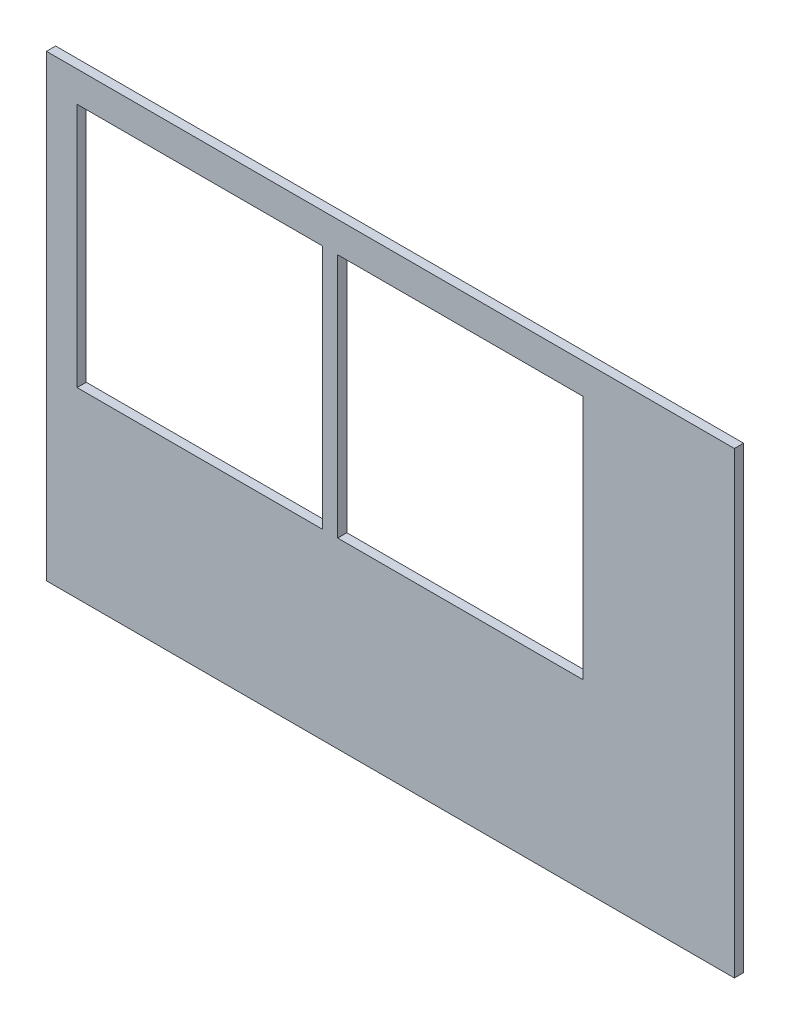
ISO-10303-21;
HEADER;
FILE_DESCRIPTION(('STEP AP214'),'2;1');
FILE_NAME('part.step','',(''),(''),'','','');
FILE_SCHEMA(('AUTOMOTIVE_DESIGN { 1 0 10303 214 1 1 1 1 }'));
ENDSEC;
DATA;
#1=APPLICATION_CONTEXT('core data for automotive mechanical design processes');
#2=APPLICATION_PROTOCOL_DEFINITION('international standard','automotive_design',2000,#1);
#3=PRODUCT_CONTEXT('',#1,'mechanical');
#4=PRODUCT('Part','Part','',(#3));
#5=PRODUCT_RELATED_PRODUCT_CATEGORY('part','',(#4));
#6=PRODUCT_DEFINITION_FORMATION('','',#4);
#7=PRODUCT_DEFINITION_CONTEXT('part definition',#1,'design');
#8=PRODUCT_DEFINITION('design','',#6,#7);
#9=PRODUCT_DEFINITION_SHAPE('','',#8);
#10=(LENGTH_UNIT() NAMED_UNIT(*) SI_UNIT(.MILLI.,.METRE.));
#11=(NAMED_UNIT(*) PLANE_ANGLE_UNIT() SI_UNIT($,.RADIAN.));
#12=(NAMED_UNIT(*) SI_UNIT($,.STERADIAN.) SOLID_ANGLE_UNIT());
#13=UNCERTAINTY_MEASURE_WITH_UNIT(LENGTH_MEASURE(1.E-05),#10,'distance_accuracy_value','');
#14=(GEOMETRIC_REPRESENTATION_CONTEXT(3) GLOBAL_UNCERTAINTY_ASSIGNED_CONTEXT((#13)) GLOBAL_UNIT_ASSIGNED_CONTEXT((#10,
#11,#12)) REPRESENTATION_CONTEXT('',''));
#15=CARTESIAN_POINT('',(0.,0.,0.));
#16=DIRECTION('',(0.,0.,1.));
#17=DIRECTION('',(1.,0.,0.));
#18=AXIS2_PLACEMENT_3D('',#15,#16,#17);
#19=CARTESIAN_POINT('',(0.,0.,12.));
#20=DIRECTION('',(0.,0.,1.));
#21=DIRECTION('',(1.,0.,0.));
#22=AXIS2_PLACEMENT_3D('',#19,#20,#21);
#23=PLANE('',#22);
#24=DIRECTION('',(0.,1.,0.));
#25=VECTOR('',#24,1.);
#26=CARTESIAN_POINT('',(1435.34693877551,1.08013847684797E-13,12.));
#27=LINE('',#26,#25);
#28=CARTESIAN_POINT('',(1435.34693877551,1.08013847684797E-13,12.));
#29=VERTEX_POINT('',#28);
#30=CARTESIAN_POINT('',(1435.34693877551,600.,12.));
#31=VERTEX_POINT('',#30);
#32=EDGE_CURVE('E189',#29,#31,#27,.T.);
#33=ORIENTED_EDGE('',*,*,#32,.T.);
#34=DIRECTION('',(-1.,0.,0.));
#35=VECTOR('',#34,1.);
#36=CARTESIAN_POINT('',(1435.34693877551,600.,12.));
#37=LINE('',#36,#35);
#38=CARTESIAN_POINT('',(535.34693877551,600.,12.));
#39=VERTEX_POINT('',#38);
#40=EDGE_CURVE('E192',#31,#39,#37,.T.);
#41=ORIENTED_EDGE('',*,*,#40,.T.);
#42=DIRECTION('',(0.,-1.,0.));
#43=VECTOR('',#42,1.);
#44=CARTESIAN_POINT('',(535.34693877551,0.,12.));
#45=LINE('',#44,#43);
#46=CARTESIAN_POINT('',(535.34693877551,0.,12.));
#47=VERTEX_POINT('',#46);
#48=EDGE_CURVE('E195',#39,#47,#45,.T.);
#49=ORIENTED_EDGE('',*,*,#48,.T.);
#50=DIRECTION('',(1.,0.,0.));
#51=VECTOR('',#50,1.);
#52=CARTESIAN_POINT('',(1435.34693877551,1.08013847684797E-13,12.));
#53=LINE('',#52,#51);
#54=EDGE_CURVE('E197',#47,#29,#53,.T.);
#55=ORIENTED_EDGE('',*,*,#54,.T.);
#56=EDGE_LOOP('',(#33,#41,#49,#55));
#57=FACE_BOUND('',#56,.T.);
#58=DIRECTION('',(-1.,0.,0.));
#59=VECTOR('',#58,1.);
#60=CARTESIAN_POINT('',(1237.34693877551,560.,12.));
#61=LINE('',#60,#59);
#62=CARTESIAN_POINT('',(1237.34693877551,560.,12.));
#63=VERTEX_POINT('',#62);
#64=CARTESIAN_POINT('',(916.34693877551,560.,12.));
#65=VERTEX_POINT('',#64);
#66=EDGE_CURVE('E160',#63,#65,#61,.T.);
#67=ORIENTED_EDGE('',*,*,#66,.F.);
#68=DIRECTION('',(0.,1.,0.));
#69=VECTOR('',#68,1.);
#70=CARTESIAN_POINT('',(1237.34693877551,560.,12.));
#71=LINE('',#70,#69);
#72=CARTESIAN_POINT('',(1237.34693877551,239.,12.));
#73=VERTEX_POINT('',#72);
#74=EDGE_CURVE('E158',#73,#63,#71,.T.);
#75=ORIENTED_EDGE('',*,*,#74,.F.);
#76=DIRECTION('',(1.,0.,0.));
#77=VECTOR('',#76,1.);
#78=CARTESIAN_POINT('',(1237.34693877551,239.,12.));
#79=LINE('',#78,#77);
#80=CARTESIAN_POINT('',(916.34693877551,239.,12.));
#81=VERTEX_POINT('',#80);
#82=EDGE_CURVE('E166',#81,#73,#79,.T.);
#83=ORIENTED_EDGE('',*,*,#82,.F.);
#84=DIRECTION('',(0.,-1.,0.));
#85=VECTOR('',#84,1.);
#86=CARTESIAN_POINT('',(916.34693877551,560.,12.));
#87=LINE('',#86,#85);
#88=EDGE_CURVE('E163',#65,#81,#87,.T.);
#89=ORIENTED_EDGE('',*,*,#88,.F.);
#90=EDGE_LOOP('',(#67,#75,#83,#89));
#91=FACE_BOUND('',#90,.T.);
#92=DIRECTION('',(-1.,0.,0.));
#93=VECTOR('',#92,1.);
#94=CARTESIAN_POINT('',(896.34693877551,560.,12.));
#95=LINE('',#94,#93);
#96=CARTESIAN_POINT('',(896.34693877551,560.,12.));
#97=VERTEX_POINT('',#96);
#98=CARTESIAN_POINT('',(575.34693877551,560.,12.));
#99=VERTEX_POINT('',#98);
#100=EDGE_CURVE('E130',#97,#99,#95,.T.);
#101=ORIENTED_EDGE('',*,*,#100,.F.);
#102=DIRECTION('',(0.,1.,0.));
#103=VECTOR('',#102,1.);
#104=CARTESIAN_POINT('',(896.34693877551,239.,12.));
#105=LINE('',#104,#103);
#106=CARTESIAN_POINT('',(896.34693877551,239.,12.));
#107=VERTEX_POINT('',#106);
#108=EDGE_CURVE('E122',#107,#97,#105,.T.);
#109=ORIENTED_EDGE('',*,*,#108,.F.);
#110=DIRECTION('',(1.,0.,0.));
#111=VECTOR('',#110,1.);
#112=CARTESIAN_POINT('',(896.34693877551,239.,12.));
#113=LINE('',#112,#111);
#114=CARTESIAN_POINT('',(575.34693877551,239.,12.));
#115=VERTEX_POINT('',#114);
#116=EDGE_CURVE('E144',#115,#107,#113,.T.);
#117=ORIENTED_EDGE('',*,*,#116,.F.);
#118=DIRECTION('',(0.,-1.,0.));
#119=VECTOR('',#118,1.);
#120=CARTESIAN_POINT('',(575.34693877551,239.,12.));
#121=LINE('',#120,#119);
#122=EDGE_CURVE('E142',#99,#115,#121,.T.);
#123=ORIENTED_EDGE('',*,*,#122,.F.);
#124=EDGE_LOOP('',(#101,#109,#117,#123));
#125=FACE_BOUND('',#124,.T.);
#126=ADVANCED_FACE('F33',(#57,#91,#125),#23,.T.);
#127=CARTESIAN_POINT('',(0.,0.,0.));
#128=DIRECTION('',(0.,0.,1.));
#129=DIRECTION('',(1.,0.,0.));
#130=AXIS2_PLACEMENT_3D('',#127,#128,#129);
#131=PLANE('',#130);
#132=DIRECTION('',(0.,1.,0.));
#133=VECTOR('',#132,1.);
#134=CARTESIAN_POINT('',(1237.34693877551,560.,0.));
#135=LINE('',#134,#133);
#136=CARTESIAN_POINT('',(1237.34693877551,239.,0.));
#137=VERTEX_POINT('',#136);
#138=CARTESIAN_POINT('',(1237.34693877551,560.,0.));
#139=VERTEX_POINT('',#138);
#140=EDGE_CURVE('E138',#137,#139,#135,.T.);
#141=ORIENTED_EDGE('',*,*,#140,.T.);
#142=DIRECTION('',(-1.,0.,0.));
#143=VECTOR('',#142,1.);
#144=CARTESIAN_POINT('',(1237.34693877551,560.,0.));
#145=LINE('',#144,#143);
#146=CARTESIAN_POINT('',(916.34693877551,560.,0.));
#147=VERTEX_POINT('',#146);
#148=EDGE_CURVE('E171',#139,#147,#145,.T.);
#149=ORIENTED_EDGE('',*,*,#148,.T.);
#150=DIRECTION('',(0.,-1.,0.));
#151=VECTOR('',#150,1.);
#152=CARTESIAN_POINT('',(916.34693877551,560.,0.));
#153=LINE('',#152,#151);
#154=CARTESIAN_POINT('',(916.34693877551,239.,0.));
#155=VERTEX_POINT('',#154);
#156=EDGE_CURVE('E174',#147,#155,#153,.T.);
#157=ORIENTED_EDGE('',*,*,#156,.T.);
#158=DIRECTION('',(1.,0.,0.));
#159=VECTOR('',#158,1.);
#160=CARTESIAN_POINT('',(1237.34693877551,239.,0.));
#161=LINE('',#160,#159);
#162=EDGE_CURVE('E161',#155,#137,#161,.T.);
#163=ORIENTED_EDGE('',*,*,#162,.T.);
#164=EDGE_LOOP('',(#141,#149,#157,#163));
#165=FACE_BOUND('',#164,.T.);
#166=DIRECTION('',(0.,1.,0.));
#167=VECTOR('',#166,1.);
#168=CARTESIAN_POINT('',(1435.34693877551,1.08013847684797E-13,0.));
#169=LINE('',#168,#167);
#170=CARTESIAN_POINT('',(1435.34693877551,1.08013847684797E-13,0.));
#171=VERTEX_POINT('',#170);
#172=CARTESIAN_POINT('',(1435.34693877551,600.,0.));
#173=VERTEX_POINT('',#172);
#174=EDGE_CURVE('E188',#171,#173,#169,.T.);
#175=ORIENTED_EDGE('',*,*,#174,.F.);
#176=DIRECTION('',(1.,0.,0.));
#177=VECTOR('',#176,1.);
#178=CARTESIAN_POINT('',(1435.34693877551,1.08013847684797E-13,0.));
#179=LINE('',#178,#177);
#180=CARTESIAN_POINT('',(535.34693877551,0.,0.));
#181=VERTEX_POINT('',#180);
#182=EDGE_CURVE('E193',#181,#171,#179,.T.);
#183=ORIENTED_EDGE('',*,*,#182,.F.);
#184=DIRECTION('',(0.,-1.,0.));
#185=VECTOR('',#184,1.);
#186=CARTESIAN_POINT('',(535.34693877551,0.,0.));
#187=LINE('',#186,#185);
#188=CARTESIAN_POINT('',(535.34693877551,600.,0.));
#189=VERTEX_POINT('',#188);
#190=EDGE_CURVE('E204',#189,#181,#187,.T.);
#191=ORIENTED_EDGE('',*,*,#190,.F.);
#192=DIRECTION('',(-1.,0.,0.));
#193=VECTOR('',#192,1.);
#194=CARTESIAN_POINT('',(1435.34693877551,600.,0.));
#195=LINE('',#194,#193);
#196=EDGE_CURVE('E202',#173,#189,#195,.T.);
#197=ORIENTED_EDGE('',*,*,#196,.F.);
#198=EDGE_LOOP('',(#175,#183,#191,#197));
#199=FACE_BOUND('',#198,.T.);
#200=DIRECTION('',(0.,1.,0.));
#201=VECTOR('',#200,1.);
#202=CARTESIAN_POINT('',(896.34693877551,239.,0.));
#203=LINE('',#202,#201);
#204=CARTESIAN_POINT('',(896.34693877551,239.,0.));
#205=VERTEX_POINT('',#204);
#206=CARTESIAN_POINT('',(896.34693877551,560.,0.));
#207=VERTEX_POINT('',#206);
#208=EDGE_CURVE('E56',#205,#207,#203,.T.);
#209=ORIENTED_EDGE('',*,*,#208,.T.);
#210=DIRECTION('',(-1.,0.,0.));
#211=VECTOR('',#210,1.);
#212=CARTESIAN_POINT('',(896.34693877551,560.,0.));
#213=LINE('',#212,#211);
#214=CARTESIAN_POINT('',(575.34693877551,560.,0.));
#215=VERTEX_POINT('',#214);
#216=EDGE_CURVE('E137',#207,#215,#213,.T.);
#217=ORIENTED_EDGE('',*,*,#216,.T.);
#218=DIRECTION('',(0.,-1.,0.));
#219=VECTOR('',#218,1.);
#220=CARTESIAN_POINT('',(575.34693877551,239.,0.));
#221=LINE('',#220,#219);
#222=CARTESIAN_POINT('',(575.34693877551,239.,0.));
#223=VERTEX_POINT('',#222);
#224=EDGE_CURVE('E150',#215,#223,#221,.T.);
#225=ORIENTED_EDGE('',*,*,#224,.T.);
#226=DIRECTION('',(1.,0.,0.));
#227=VECTOR('',#226,1.);
#228=CARTESIAN_POINT('',(896.34693877551,239.,0.));
#229=LINE('',#228,#227);
#230=EDGE_CURVE('E131',#223,#205,#229,.T.);
#231=ORIENTED_EDGE('',*,*,#230,.T.);
#232=EDGE_LOOP('',(#209,#217,#225,#231));
#233=FACE_BOUND('',#232,.T.);
#234=ADVANCED_FACE('F222',(#165,#199,#233),#131,.F.);
#235=CARTESIAN_POINT('',(1435.34693877551,1.08013847684797E-13,12.));
#236=DIRECTION('',(-1.,0.,0.));
#237=DIRECTION('',(0.,0.,1.));
#238=AXIS2_PLACEMENT_3D('',#235,#236,#237);
#239=PLANE('',#238);
#240=ORIENTED_EDGE('',*,*,#174,.T.);
#241=DIRECTION('',(0.,0.,-1.));
#242=VECTOR('',#241,1.);
#243=CARTESIAN_POINT('',(1435.34693877551,600.,12.));
#244=LINE('',#243,#242);
#245=EDGE_CURVE('E11',#31,#173,#244,.T.);
#246=ORIENTED_EDGE('',*,*,#245,.F.);
#247=ORIENTED_EDGE('',*,*,#32,.F.);
#248=DIRECTION('',(0.,0.,-1.));
#249=VECTOR('',#248,1.);
#250=CARTESIAN_POINT('',(1435.34693877551,1.08013847684797E-13,12.));
#251=LINE('',#250,#249);
#252=EDGE_CURVE('E199',#29,#171,#251,.T.);
#253=ORIENTED_EDGE('',*,*,#252,.T.);
#254=EDGE_LOOP('',(#240,#246,#247,#253));
#255=FACE_BOUND('',#254,.T.);
#256=ADVANCED_FACE('F35',(#255),#239,.F.);
#257=CARTESIAN_POINT('',(1435.34693877551,600.,12.));
#258=DIRECTION('',(0.,-1.,0.));
#259=DIRECTION('',(1.,0.,0.));
#260=AXIS2_PLACEMENT_3D('',#257,#258,#259);
#261=PLANE('',#260);
#262=ORIENTED_EDGE('',*,*,#196,.T.);
#263=DIRECTION('',(0.,0.,-1.));
#264=VECTOR('',#263,1.);
#265=CARTESIAN_POINT('',(535.34693877551,600.,12.));
#266=LINE('',#265,#264);
#267=EDGE_CURVE('E41',#39,#189,#266,.T.);
#268=ORIENTED_EDGE('',*,*,#267,.F.);
#269=ORIENTED_EDGE('',*,*,#40,.F.);
#270=ORIENTED_EDGE('',*,*,#245,.T.);
#271=EDGE_LOOP('',(#262,#268,#269,#270));
#272=FACE_BOUND('',#271,.T.);
#273=ADVANCED_FACE('F233',(#272),#261,.F.);
#274=CARTESIAN_POINT('',(535.34693877551,0.,12.));
#275=DIRECTION('',(1.,0.,0.));
#276=DIRECTION('',(0.,0.,-1.));
#277=AXIS2_PLACEMENT_3D('',#274,#275,#276);
#278=PLANE('',#277);
#279=ORIENTED_EDGE('',*,*,#190,.T.);
#280=DIRECTION('',(0.,0.,-1.));
#281=VECTOR('',#280,1.);
#282=CARTESIAN_POINT('',(535.34693877551,0.,12.));
#283=LINE('',#282,#281);
#284=EDGE_CURVE('E209',#47,#181,#283,.T.);
#285=ORIENTED_EDGE('',*,*,#284,.F.);
#286=ORIENTED_EDGE('',*,*,#48,.F.);
#287=ORIENTED_EDGE('',*,*,#267,.T.);
#288=EDGE_LOOP('',(#279,#285,#286,#287));
#289=FACE_BOUND('',#288,.T.);
#290=ADVANCED_FACE('F216',(#289),#278,.F.);
#291=CARTESIAN_POINT('',(1435.34693877551,1.08013847684797E-13,12.));
#292=DIRECTION('',(0.,1.,0.));
#293=DIRECTION('',(-1.,0.,0.));
#294=AXIS2_PLACEMENT_3D('',#291,#292,#293);
#295=PLANE('',#294);
#296=ORIENTED_EDGE('',*,*,#182,.T.);
#297=ORIENTED_EDGE('',*,*,#252,.F.);
#298=ORIENTED_EDGE('',*,*,#54,.F.);
#299=ORIENTED_EDGE('',*,*,#284,.T.);
#300=EDGE_LOOP('',(#296,#297,#298,#299));
#301=FACE_BOUND('',#300,.T.);
#302=ADVANCED_FACE('F226',(#301),#295,.F.);
#303=CARTESIAN_POINT('',(1237.34693877551,560.,12.));
#304=DIRECTION('',(-1.,0.,0.));
#305=DIRECTION('',(0.,-1.,0.));
#306=AXIS2_PLACEMENT_3D('',#303,#304,#305);
#307=PLANE('',#306);
#308=ORIENTED_EDGE('',*,*,#140,.F.);
#309=DIRECTION('',(0.,0.,-1.));
#310=VECTOR('',#309,1.);
#311=CARTESIAN_POINT('',(1237.34693877551,239.,12.));
#312=LINE('',#311,#310);
#313=EDGE_CURVE('E168',#73,#137,#312,.T.);
#314=ORIENTED_EDGE('',*,*,#313,.F.);
#315=ORIENTED_EDGE('',*,*,#74,.T.);
#316=DIRECTION('',(0.,0.,-1.));
#317=VECTOR('',#316,1.);
#318=CARTESIAN_POINT('',(1237.34693877551,560.,12.));
#319=LINE('',#318,#317);
#320=EDGE_CURVE('E185',#63,#139,#319,.T.);
#321=ORIENTED_EDGE('',*,*,#320,.T.);
#322=EDGE_LOOP('',(#308,#314,#315,#321));
#323=FACE_BOUND('',#322,.T.);
#324=ADVANCED_FACE('F248',(#323),#307,.T.);
#325=CARTESIAN_POINT('',(1237.34693877551,560.,12.));
#326=DIRECTION('',(0.,-1.,0.));
#327=DIRECTION('',(1.,0.,0.));
#328=AXIS2_PLACEMENT_3D('',#325,#326,#327);
#329=PLANE('',#328);
#330=ORIENTED_EDGE('',*,*,#148,.F.);
#331=ORIENTED_EDGE('',*,*,#320,.F.);
#332=ORIENTED_EDGE('',*,*,#66,.T.);
#333=DIRECTION('',(0.,0.,-1.));
#334=VECTOR('',#333,1.);
#335=CARTESIAN_POINT('',(916.34693877551,560.,12.));
#336=LINE('',#335,#334);
#337=EDGE_CURVE('E183',#65,#147,#336,.T.);
#338=ORIENTED_EDGE('',*,*,#337,.T.);
#339=EDGE_LOOP('',(#330,#331,#332,#338));
#340=FACE_BOUND('',#339,.T.);
#341=ADVANCED_FACE('F255',(#340),#329,.T.);
#342=CARTESIAN_POINT('',(916.34693877551,560.,12.));
#343=DIRECTION('',(1.,0.,0.));
#344=DIRECTION('',(0.,0.,-1.));
#345=AXIS2_PLACEMENT_3D('',#342,#343,#344);
#346=PLANE('',#345);
#347=ORIENTED_EDGE('',*,*,#156,.F.);
#348=ORIENTED_EDGE('',*,*,#337,.F.);
#349=ORIENTED_EDGE('',*,*,#88,.T.);
#350=DIRECTION('',(0.,0.,-1.));
#351=VECTOR('',#350,1.);
#352=CARTESIAN_POINT('',(916.34693877551,239.,12.));
#353=LINE('',#352,#351);
#354=EDGE_CURVE('E181',#81,#155,#353,.T.);
#355=ORIENTED_EDGE('',*,*,#354,.T.);
#356=EDGE_LOOP('',(#347,#348,#349,#355));
#357=FACE_BOUND('',#356,.T.);
#358=ADVANCED_FACE('F260',(#357),#346,.T.);
#359=CARTESIAN_POINT('',(1237.34693877551,239.,12.));
#360=DIRECTION('',(0.,1.,0.));
#361=DIRECTION('',(-1.,0.,0.));
#362=AXIS2_PLACEMENT_3D('',#359,#360,#361);
#363=PLANE('',#362);
#364=ORIENTED_EDGE('',*,*,#162,.F.);
#365=ORIENTED_EDGE('',*,*,#354,.F.);
#366=ORIENTED_EDGE('',*,*,#82,.T.);
#367=ORIENTED_EDGE('',*,*,#313,.T.);
#368=EDGE_LOOP('',(#364,#365,#366,#367));
#369=FACE_BOUND('',#368,.T.);
#370=ADVANCED_FACE('F267',(#369),#363,.T.);
#371=CARTESIAN_POINT('',(896.34693877551,239.,12.));
#372=DIRECTION('',(-1.,0.,0.));
#373=DIRECTION('',(0.,0.,1.));
#374=AXIS2_PLACEMENT_3D('',#371,#372,#373);
#375=PLANE('',#374);
#376=ORIENTED_EDGE('',*,*,#208,.F.);
#377=DIRECTION('',(0.,0.,-1.));
#378=VECTOR('',#377,1.);
#379=CARTESIAN_POINT('',(896.34693877551,239.,12.));
#380=LINE('',#379,#378);
#381=EDGE_CURVE('E126',#107,#205,#380,.T.);
#382=ORIENTED_EDGE('',*,*,#381,.F.);
#383=ORIENTED_EDGE('',*,*,#108,.T.);
#384=DIRECTION('',(0.,0.,-1.));
#385=VECTOR('',#384,1.);
#386=CARTESIAN_POINT('',(896.34693877551,560.,12.));
#387=LINE('',#386,#385);
#388=EDGE_CURVE('E125',#97,#207,#387,.T.);
#389=ORIENTED_EDGE('',*,*,#388,.T.);
#390=EDGE_LOOP('',(#376,#382,#383,#389));
#391=FACE_BOUND('',#390,.T.);
#392=ADVANCED_FACE('F124',(#391),#375,.T.);
#393=CARTESIAN_POINT('',(896.34693877551,560.,12.));
#394=DIRECTION('',(0.,-1.,0.));
#395=DIRECTION('',(0.,0.,-1.));
#396=AXIS2_PLACEMENT_3D('',#393,#394,#395);
#397=PLANE('',#396);
#398=ORIENTED_EDGE('',*,*,#216,.F.);
#399=ORIENTED_EDGE('',*,*,#388,.F.);
#400=ORIENTED_EDGE('',*,*,#100,.T.);
#401=DIRECTION('',(0.,0.,-1.));
#402=VECTOR('',#401,1.);
#403=CARTESIAN_POINT('',(575.34693877551,560.,12.));
#404=LINE('',#403,#402);
#405=EDGE_CURVE('E139',#99,#215,#404,.T.);
#406=ORIENTED_EDGE('',*,*,#405,.T.);
#407=EDGE_LOOP('',(#398,#399,#400,#406));
#408=FACE_BOUND('',#407,.T.);
#409=ADVANCED_FACE('F134',(#408),#397,.T.);
#410=CARTESIAN_POINT('',(575.34693877551,239.,12.));
#411=DIRECTION('',(1.,0.,0.));
#412=DIRECTION('',(0.,1.,0.));
#413=AXIS2_PLACEMENT_3D('',#410,#411,#412);
#414=PLANE('',#413);
#415=ORIENTED_EDGE('',*,*,#224,.F.);
#416=ORIENTED_EDGE('',*,*,#405,.F.);
#417=ORIENTED_EDGE('',*,*,#122,.T.);
#418=DIRECTION('',(0.,0.,-1.));
#419=VECTOR('',#418,1.);
#420=CARTESIAN_POINT('',(575.34693877551,239.,12.));
#421=LINE('',#420,#419);
#422=EDGE_CURVE('E48',#115,#223,#421,.T.);
#423=ORIENTED_EDGE('',*,*,#422,.T.);
#424=EDGE_LOOP('',(#415,#416,#417,#423));
#425=FACE_BOUND('',#424,.T.);
#426=ADVANCED_FACE('F285',(#425),#414,.T.);
#427=CARTESIAN_POINT('',(896.34693877551,239.,12.));
#428=DIRECTION('',(0.,1.,0.));
#429=DIRECTION('',(-1.,0.,0.));
#430=AXIS2_PLACEMENT_3D('',#427,#428,#429);
#431=PLANE('',#430);
#432=ORIENTED_EDGE('',*,*,#230,.F.);
#433=ORIENTED_EDGE('',*,*,#422,.F.);
#434=ORIENTED_EDGE('',*,*,#116,.T.);
#435=ORIENTED_EDGE('',*,*,#381,.T.);
#436=EDGE_LOOP('',(#432,#433,#434,#435));
#437=FACE_BOUND('',#436,.T.);
#438=ADVANCED_FACE('F288',(#437),#431,.T.);
#439=CLOSED_SHELL('',(#126,#234,#256,#273,#290,#302,#324,#341,#358,#370,#392,#409,#426,#438));
#440=MANIFOLD_SOLID_BREP('B2',#439);
#441=ADVANCED_BREP_SHAPE_REPRESENTATION('',(#18,#440),#14);
#442=SHAPE_DEFINITION_REPRESENTATION(#9,#441);
ENDSEC;
END-ISO-10303-21;
